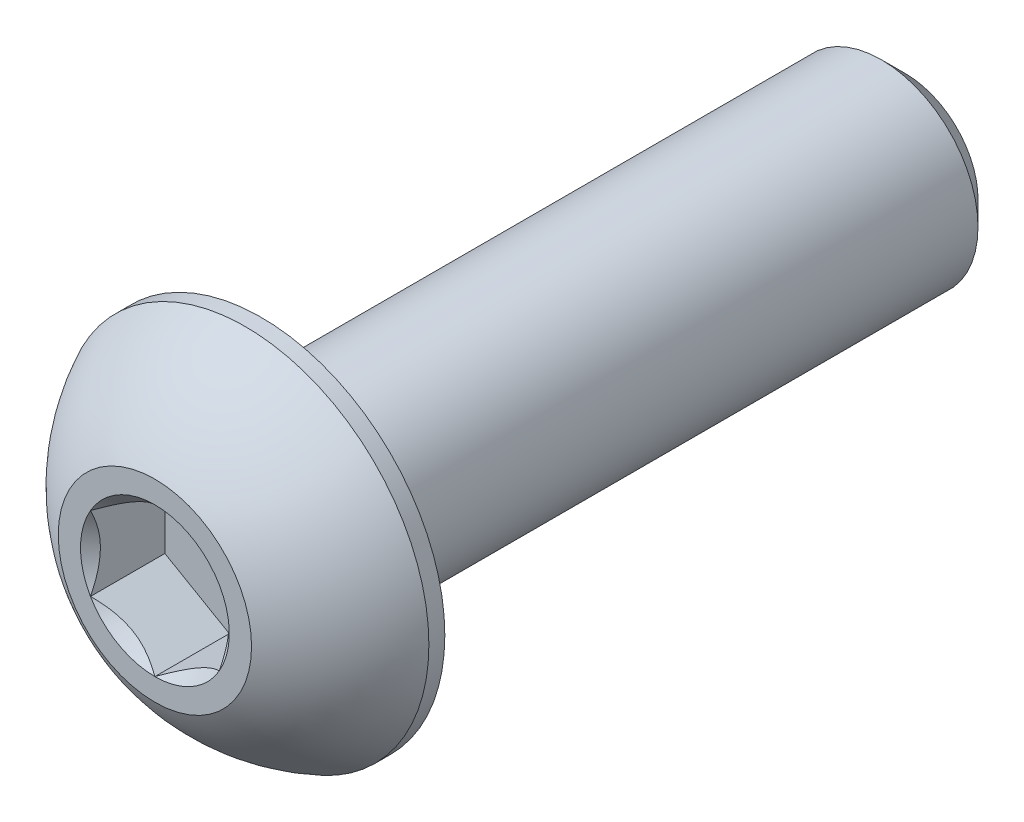
ISO-10303-21;
HEADER;
FILE_DESCRIPTION(('STEP AP214'),'2;1');
FILE_NAME('part.step','',(''),(''),'','','');
FILE_SCHEMA(('AUTOMOTIVE_DESIGN { 1 0 10303 214 1 1 1 1 }'));
ENDSEC;
DATA;
#1=APPLICATION_CONTEXT('core data for automotive mechanical design processes');
#2=APPLICATION_PROTOCOL_DEFINITION('international standard','automotive_design',2000,#1);
#3=PRODUCT_CONTEXT('',#1,'mechanical');
#4=PRODUCT('Part','Part','',(#3));
#5=PRODUCT_RELATED_PRODUCT_CATEGORY('part','',(#4));
#6=PRODUCT_DEFINITION_FORMATION('','',#4);
#7=PRODUCT_DEFINITION_CONTEXT('part definition',#1,'design');
#8=PRODUCT_DEFINITION('design','',#6,#7);
#9=PRODUCT_DEFINITION_SHAPE('','',#8);
#10=(LENGTH_UNIT() NAMED_UNIT(*) SI_UNIT(.MILLI.,.METRE.));
#11=(NAMED_UNIT(*) PLANE_ANGLE_UNIT() SI_UNIT($,.RADIAN.));
#12=(NAMED_UNIT(*) SI_UNIT($,.STERADIAN.) SOLID_ANGLE_UNIT());
#13=UNCERTAINTY_MEASURE_WITH_UNIT(LENGTH_MEASURE(1.E-05),#10,'distance_accuracy_value','');
#14=(GEOMETRIC_REPRESENTATION_CONTEXT(3) GLOBAL_UNCERTAINTY_ASSIGNED_CONTEXT((#13)) GLOBAL_UNIT_ASSIGNED_CONTEXT((#10,
#11,#12)) REPRESENTATION_CONTEXT('',''));
#15=CARTESIAN_POINT('',(0.,0.,0.));
#16=DIRECTION('',(0.,0.,1.));
#17=DIRECTION('',(1.,0.,0.));
#18=AXIS2_PLACEMENT_3D('',#15,#16,#17);
#19=CARTESIAN_POINT('',(0.,-1.5,-11.65));
#20=DIRECTION('',(0.,0.,-1.));
#21=DIRECTION('',(0.,1.,0.));
#22=AXIS2_PLACEMENT_3D('',#19,#20,#21);
#23=PLANE('',#22);
#24=CARTESIAN_POINT('',(0.,0.,-11.65));
#25=DIRECTION('',(0.,0.,-1.));
#26=DIRECTION('',(0.,1.,0.));
#27=AXIS2_PLACEMENT_3D('',#24,#25,#26);
#28=CIRCLE('',#27,1.125);
#29=CARTESIAN_POINT('',(0.,1.125,-11.65));
#30=VERTEX_POINT('',#29);
#31=EDGE_CURVE('E181',#30,#30,#28,.T.);
#32=ORIENTED_EDGE('',*,*,#31,.T.);
#33=EDGE_LOOP('',(#32));
#34=FACE_BOUND('',#33,.T.);
#35=ADVANCED_FACE('F41',(#34),#23,.T.);
#36=CARTESIAN_POINT('',(0.,0.,-11.65));
#37=DIRECTION('',(0.,0.,-1.));
#38=DIRECTION('',(0.,1.,0.));
#39=AXIS2_PLACEMENT_3D('',#36,#37,#38);
#40=CYLINDRICAL_SURFACE('',#39,1.5);
#41=CARTESIAN_POINT('',(0.,0.,-11.275));
#42=DIRECTION('',(0.,0.,-1.));
#43=DIRECTION('',(0.,1.,0.));
#44=AXIS2_PLACEMENT_3D('',#41,#42,#43);
#45=CIRCLE('',#44,1.5);
#46=CARTESIAN_POINT('',(0.,1.5,-11.275));
#47=VERTEX_POINT('',#46);
#48=EDGE_CURVE('E55',#47,#47,#45,.F.);
#49=ORIENTED_EDGE('',*,*,#48,.T.);
#50=EDGE_LOOP('',(#49));
#51=FACE_BOUND('',#50,.T.);
#52=CARTESIAN_POINT('',(0.,0.,-1.65));
#53=DIRECTION('',(0.,0.,1.));
#54=DIRECTION('',(1.,0.,0.));
#55=AXIS2_PLACEMENT_3D('',#52,#53,#54);
#56=CIRCLE('',#55,1.5);
#57=CARTESIAN_POINT('',(1.5,0.,-1.65));
#58=VERTEX_POINT('',#57);
#59=EDGE_CURVE('E178',#58,#58,#56,.F.);
#60=ORIENTED_EDGE('',*,*,#59,.T.);
#61=EDGE_LOOP('',(#60));
#62=FACE_BOUND('',#61,.T.);
#63=ADVANCED_FACE('F186',(#51,#62),#40,.T.);
#64=CARTESIAN_POINT('',(0.,0.,-11.65));
#65=DIRECTION('',(0.,0.,1.));
#66=DIRECTION('',(0.,-1.,0.));
#67=AXIS2_PLACEMENT_3D('',#64,#65,#66);
#68=CONICAL_SURFACE('',#67,1.125,0.785398163397451);
#69=ORIENTED_EDGE('',*,*,#48,.F.);
#70=EDGE_LOOP('',(#69));
#71=FACE_BOUND('',#70,.T.);
#72=ORIENTED_EDGE('',*,*,#31,.F.);
#73=EDGE_LOOP('',(#72));
#74=FACE_BOUND('',#73,.T.);
#75=ADVANCED_FACE('F43',(#71,#74),#68,.T.);
#76=CARTESIAN_POINT('',(0.,0.,-2.79483288770053));
#77=DIRECTION('',(0.,0.,1.));
#78=DIRECTION('',(0.,-1.,0.));
#79=AXIS2_PLACEMENT_3D('',#76,#77,#78);
#80=SPHERICAL_SURFACE('',#79,3.17192226735973);
#81=CARTESIAN_POINT('',(0.,0.,0.));
#82=DIRECTION('',(0.,0.,1.));
#83=DIRECTION('',(1.,0.,0.));
#84=AXIS2_PLACEMENT_3D('',#81,#82,#83);
#85=CIRCLE('',#84,1.5);
#86=CARTESIAN_POINT('',(0.,-1.5,0.));
#87=VERTEX_POINT('',#86);
#88=EDGE_CURVE('E175',#87,#87,#85,.T.);
#89=CARTESIAN_POINT('',(0.,0.,-1.4025));
#90=DIRECTION('',(0.,0.,1.));
#91=DIRECTION('',(1.,0.,0.));
#92=AXIS2_PLACEMENT_3D('',#89,#90,#91);
#93=CIRCLE('',#92,2.85);
#94=CARTESIAN_POINT('',(0.,-2.85,-1.4025));
#95=VERTEX_POINT('',#94);
#96=EDGE_CURVE('E169',#95,#95,#93,.T.);
#97=CARTESIAN_POINT('',(0.,-1.5,0.));
#98=CARTESIAN_POINT('',(0.,-1.5181600798921,-0.00974656947336528));
#99=CARTESIAN_POINT('',(0.,-1.53622513742981,-0.0196701847238475));
#100=CARTESIAN_POINT('',(0.,-1.57215840256594,-0.0398676311293121));
#101=CARTESIAN_POINT('',(0.,-1.59002661016438,-0.0501414622842944));
#102=CARTESIAN_POINT('',(0.,-1.6255593701915,-0.0710354648490241));
#103=CARTESIAN_POINT('',(0.,-1.64322392262019,-0.0816556362587714));
#104=CARTESIAN_POINT('',(0.,-1.67834266450262,-0.103238276426967));
#105=CARTESIAN_POINT('',(0.,-1.69579685395636,-0.114200745185416));
#106=CARTESIAN_POINT('',(0.,-1.73048823664554,-0.136463816635606));
#107=CARTESIAN_POINT('',(0.,-1.74772542988099,-0.147764419327347));
#108=CARTESIAN_POINT('',(0.,-1.78197627078176,-0.170699464187153));
#109=CARTESIAN_POINT('',(0.,-1.79898991844709,-0.182333906355219));
#110=CARTESIAN_POINT('',(0.,-1.83278720341135,-0.205932209546912));
#111=CARTESIAN_POINT('',(0.,-1.84957084071028,-0.21789607057054));
#112=CARTESIAN_POINT('',(0.,-1.88290172764636,-0.242148665498754));
#113=CARTESIAN_POINT('',(0.,-1.89944897728351,-0.254437399403341));
#114=CARTESIAN_POINT('',(0.,-1.93230080139369,-0.279335070725423));
#115=CARTESIAN_POINT('',(0.,-1.94860537586673,-0.291944008142919));
#116=CARTESIAN_POINT('',(0.,-1.98096565436365,-0.317477295441111));
#117=CARTESIAN_POINT('',(0.,-1.99702135838753,-0.330401645321807));
#118=CARTESIAN_POINT('',(0.,-2.02887779526297,-0.356560846652225));
#119=CARTESIAN_POINT('',(0.,-2.04467852811452,-0.369795698101948));
#120=CARTESIAN_POINT('',(0.,-2.07601901880464,-0.396570873693307));
#121=CARTESIAN_POINT('',(0.,-2.09155877664321,-0.410111197834942));
#122=CARTESIAN_POINT('',(0.,-2.12237141262985,-0.437492173862106));
#123=CARTESIAN_POINT('',(0.,-2.13764429077792,-0.451332825747633));
#124=CARTESIAN_POINT('',(0.,-2.16791736411296,-0.479309198198268));
#125=CARTESIAN_POINT('',(0.,-2.18291755929993,-0.493444918763374));
#126=CARTESIAN_POINT('',(0.,-2.21263956705415,-0.52200605739095));
#127=CARTESIAN_POINT('',(0.,-2.22736137962139,-0.536431475453418));
#128=CARTESIAN_POINT('',(0.,-2.2565210282552,-0.56556652781647));
#129=CARTESIAN_POINT('',(0.,-2.27095886432178,-0.580276162117054));
#130=CARTESIAN_POINT('',(0.,-2.2995450739765,-0.609974057702794));
#131=CARTESIAN_POINT('',(0.,-2.31369344756465,-0.624962318987951));
#132=CARTESIAN_POINT('',(0.,-2.34169535627252,-0.655211773418758));
#133=CARTESIAN_POINT('',(0.,-2.35554889139224,-0.670472966564409));
#134=CARTESIAN_POINT('',(0.,-2.38295585920366,-0.701262485885582));
#135=CARTESIAN_POINT('',(0.,-2.39650929189537,-0.716790812061104));
#136=CARTESIAN_POINT('',(0.,-2.42331090492182,-0.748108697108241));
#137=CARTESIAN_POINT('',(0.,-2.43655908525656,-0.763898255979857));
#138=CARTESIAN_POINT('',(0.,-2.46274515962755,-0.795732606824226));
#139=CARTESIAN_POINT('',(0.,-2.47568305366379,-0.811777398796979));
#140=CARTESIAN_POINT('',(0.,-2.50124363939651,-0.844116119267125));
#141=CARTESIAN_POINT('',(0.,-2.51386633109298,-0.860410047764518));
#142=CARTESIAN_POINT('',(0.,-2.53879171587278,-0.893240850042598));
#143=CARTESIAN_POINT('',(0.,-2.55109440895612,-0.909777723823286));
#144=CARTESIAN_POINT('',(0.,-2.57537512182785,-0.943088133113639));
#145=CARTESIAN_POINT('',(0.,-2.58735314161625,-0.959861668623304));
#146=CARTESIAN_POINT('',(0.,-2.61097995657956,-0.993639027894245));
#147=CARTESIAN_POINT('',(0.,-2.62262875175448,-1.01064285165552));
#148=CARTESIAN_POINT('',(0.,-2.64559269128198,-1.04487432644225));
#149=CARTESIAN_POINT('',(0.,-2.65690783563458,-1.06210197746771));
#150=CARTESIAN_POINT('',(0.,-2.67920017403639,-1.09677456077299));
#151=CARTESIAN_POINT('',(0.,-2.69017736808561,-1.11421949305282));
#152=CARTESIAN_POINT('',(0.,-2.711789634999,-1.14932001019995));
#153=CARTESIAN_POINT('',(0.,-2.72242470786316,-1.16697559506725));
#154=CARTESIAN_POINT('',(0.,-2.74334869082118,-1.20249070903942));
#155=CARTESIAN_POINT('',(0.,-2.75363760091502,-1.22035023814429));
#156=CARTESIAN_POINT('',(0.,-2.77386535089241,-1.25626645340824));
#157=CARTESIAN_POINT('',(0.,-2.78380419077596,-1.27432313956732));
#158=CARTESIAN_POINT('',(0.,-2.80332801615778,-1.31062681184411));
#159=CARTESIAN_POINT('',(0.,-2.81291300165605,-1.32887379796182));
#160=CARTESIAN_POINT('',(0.,-2.83172550494215,-1.3655511220839));
#161=CARTESIAN_POINT('',(0.,-2.84095302272998,-1.38398146008827));
#162=CARTESIAN_POINT('',(0.,-2.85,-1.4025));
#163=B_SPLINE_CURVE_WITH_KNOTS('',3,(#97,#98,#99,#100,#101,#102,#103,#104,#105,#106,#107,#108,
#109,#110,#111,#112,#113,#114,#115,#116,#117,#118,#119,#120,#121,#122,#123,#124,#125,#126,#127,
#128,#129,#130,#131,#132,#133,#134,#135,#136,#137,#138,#139,#140,#141,#142,#143,#144,#145,#146,
#147,#148,#149,#150,#151,#152,#153,#154,#155,#156,#157,#158,#159,#160,#161,#162),.UNSPECIFIED.,
.F.,.F.,(4,2,2,2,2,2,2,2,2,2,2,2,2,2,2,2,2,2,2,2,2,2,2,2,2,2,2,2,2,2,2,2,4),(0.,
0.0618298941826979,0.123659788365397,0.185489682548095,0.247319576730792,0.309149470913491,
0.370979365096189,0.432809259278888,0.494639153461586,0.556469047644284,0.618298941826982,
0.68012883600968,0.741958730192378,0.803788624375077,0.865618518557775,0.927448412740473,
0.989278306923171,1.05110820110587,1.11293809528857,1.17476798947127,1.23659788365396,
1.29842777783666,1.36025767201936,1.42208756620206,1.48391746038476,1.54574735456745,
1.60757724875015,1.66940714293285,1.73123703711555,1.79306693129825,1.85489682548095,
1.91672671966364,1.97855661384634),.UNSPECIFIED.);
#164=EDGE_CURVE('BSEAM191',#87,#95,#163,.T.);
#165=ORIENTED_EDGE('',*,*,#88,.F.);
#166=ORIENTED_EDGE('',*,*,#96,.T.);
#167=ORIENTED_EDGE('',*,*,#164,.T.);
#168=ORIENTED_EDGE('',*,*,#164,.F.);
#169=EDGE_LOOP('',(#165,#167,#166,#168));
#170=FACE_BOUND('',#169,.T.);
#171=ADVANCED_FACE('F191',(#170),#80,.T.);
#172=CARTESIAN_POINT('',(0.,-1.5,0.));
#173=DIRECTION('',(0.,0.,-1.));
#174=DIRECTION('',(-1.,0.,0.));
#175=AXIS2_PLACEMENT_3D('',#172,#173,#174);
#176=PLANE('',#175);
#177=CARTESIAN_POINT('',(0.,0.,0.));
#178=DIRECTION('',(0.,0.,1.));
#179=DIRECTION('',(1.,0.,0.));
#180=AXIS2_PLACEMENT_3D('',#177,#178,#179);
#181=CIRCLE('',#180,1.15470053837925);
#182=CARTESIAN_POINT('',(-1.,0.577350269189626,0.));
#183=VERTEX_POINT('',#182);
#184=CARTESIAN_POINT('',(-1.,-0.577350269189626,0.));
#185=VERTEX_POINT('',#184);
#186=EDGE_CURVE('E68',#183,#185,#181,.T.);
#187=ORIENTED_EDGE('',*,*,#186,.F.);
#188=CARTESIAN_POINT('',(0.,1.15470053837925,0.));
#189=VERTEX_POINT('',#188);
#190=EDGE_CURVE('E140',#189,#183,#181,.T.);
#191=ORIENTED_EDGE('',*,*,#190,.F.);
#192=CARTESIAN_POINT('',(1.,0.577350269189626,0.));
#193=VERTEX_POINT('',#192);
#194=EDGE_CURVE('E137',#193,#189,#181,.T.);
#195=ORIENTED_EDGE('',*,*,#194,.F.);
#196=CARTESIAN_POINT('',(1.,-0.577350269189626,0.));
#197=VERTEX_POINT('',#196);
#198=EDGE_CURVE('E108',#197,#193,#181,.T.);
#199=ORIENTED_EDGE('',*,*,#198,.F.);
#200=CARTESIAN_POINT('',(0.,-1.15470053837925,0.));
#201=VERTEX_POINT('',#200);
#202=EDGE_CURVE('E100',#201,#197,#181,.T.);
#203=ORIENTED_EDGE('',*,*,#202,.F.);
#204=EDGE_CURVE('E61',#185,#201,#181,.T.);
#205=ORIENTED_EDGE('',*,*,#204,.F.);
#206=EDGE_LOOP('',(#187,#191,#195,#199,#203,#205));
#207=FACE_BOUND('',#206,.T.);
#208=ORIENTED_EDGE('',*,*,#88,.T.);
#209=EDGE_LOOP('',(#208));
#210=FACE_BOUND('',#209,.T.);
#211=ADVANCED_FACE('F134',(#207,#210),#176,.F.);
#212=CARTESIAN_POINT('',(0.,-2.85,-1.65));
#213=DIRECTION('',(0.,0.,1.));
#214=DIRECTION('',(1.,0.,0.));
#215=AXIS2_PLACEMENT_3D('',#212,#213,#214);
#216=PLANE('',#215);
#217=ORIENTED_EDGE('',*,*,#59,.F.);
#218=EDGE_LOOP('',(#217));
#219=FACE_BOUND('',#218,.T.);
#220=CARTESIAN_POINT('',(0.,0.,-1.65));
#221=DIRECTION('',(0.,0.,1.));
#222=DIRECTION('',(1.,0.,0.));
#223=AXIS2_PLACEMENT_3D('',#220,#221,#222);
#224=CIRCLE('',#223,2.85);
#225=CARTESIAN_POINT('',(2.85,0.,-1.65));
#226=VERTEX_POINT('',#225);
#227=EDGE_CURVE('E172',#226,#226,#224,.T.);
#228=ORIENTED_EDGE('',*,*,#227,.F.);
#229=EDGE_LOOP('',(#228));
#230=FACE_BOUND('',#229,.T.);
#231=ADVANCED_FACE('F205',(#219,#230),#216,.F.);
#232=CARTESIAN_POINT('',(0.,0.,0.));
#233=DIRECTION('',(0.,0.,1.));
#234=DIRECTION('',(1.,0.,0.));
#235=AXIS2_PLACEMENT_3D('',#232,#233,#234);
#236=CYLINDRICAL_SURFACE('',#235,2.85);
#237=ORIENTED_EDGE('',*,*,#96,.F.);
#238=EDGE_LOOP('',(#237));
#239=FACE_BOUND('',#238,.T.);
#240=ORIENTED_EDGE('',*,*,#227,.T.);
#241=EDGE_LOOP('',(#240));
#242=FACE_BOUND('',#241,.T.);
#243=ADVANCED_FACE('F208',(#239,#242),#236,.T.);
#244=CARTESIAN_POINT('',(0.,0.,0.));
#245=DIRECTION('',(0.,0.,1.));
#246=DIRECTION('',(1.,0.,0.));
#247=AXIS2_PLACEMENT_3D('',#244,#245,#246);
#248=CONICAL_SURFACE('',#247,1.15470053837925,0.78539816339745);
#249=ORIENTED_EDGE('',*,*,#198,.T.);
#250=CARTESIAN_POINT('',(1.,-1.15147208646462,0.37038567751386));
#251=CARTESIAN_POINT('',(1.,-1.12343447988552,0.349219919873711));
#252=CARTESIAN_POINT('',(1.,-1.09524064850697,0.328261692175909));
#253=CARTESIAN_POINT('',(1.,-1.03847715644376,0.28684602223562));
#254=CARTESIAN_POINT('',(1.,-1.00990740382975,0.266388706123658));
#255=CARTESIAN_POINT('',(1.,-0.923120894333476,0.205604794954508));
#256=CARTESIAN_POINT('',(1.,-0.864253173759059,0.166192228961397));
#257=CARTESIAN_POINT('',(1.,-0.740809858258045,0.0888206642002041));
#258=CARTESIAN_POINT('',(1.,-0.676100255137807,0.0510730391143413));
#259=CARTESIAN_POINT('',(1.,-0.543448939049124,-0.0179754124487091));
#260=CARTESIAN_POINT('',(1.,-0.475519112027778,-0.0492979721531354));
#261=CARTESIAN_POINT('',(1.,-0.373555850333528,-0.0876182211162059));
#262=CARTESIAN_POINT('',(1.,-0.341031989670907,-0.0986164083578445));
#263=CARTESIAN_POINT('',(1.,-0.275199079052293,-0.11800165785264));
#264=CARTESIAN_POINT('',(1.,-0.241889975173933,-0.126388540223302));
#265=CARTESIAN_POINT('',(1.,-0.175247517042992,-0.139974779280984));
#266=CARTESIAN_POINT('',(1.,-0.141925568218174,-0.145229209232033));
#267=CARTESIAN_POINT('',(1.,-0.0749144362322786,-0.152451313429108));
#268=CARTESIAN_POINT('',(1.,-0.0412251978501615,-0.154418486389493));
#269=CARTESIAN_POINT('',(1.,0.0249580992634212,-0.15491680160684));
#270=CARTESIAN_POINT('',(1.,0.0574512826460394,-0.153569732111366));
#271=CARTESIAN_POINT('',(1.,0.122148505701867,-0.147783515501016));
#272=CARTESIAN_POINT('',(1.,0.154352610132927,-0.143345079338465));
#273=CARTESIAN_POINT('',(1.,0.21879989886764,-0.131543169854797));
#274=CARTESIAN_POINT('',(1.,0.251033743268954,-0.124129458961492));
#275=CARTESIAN_POINT('',(1.,0.314797132354919,-0.106771057501325));
#276=CARTESIAN_POINT('',(1.,0.346326735731005,-0.096826578711171));
#277=CARTESIAN_POINT('',(1.,0.445594187730205,-0.061776517445664));
#278=CARTESIAN_POINT('',(1.,0.511919139476037,-0.0326791416432762));
#279=CARTESIAN_POINT('',(1.,0.641453244657532,0.032015329686504));
#280=CARTESIAN_POINT('',(1.,0.704650133126344,0.0676357767152409));
#281=CARTESIAN_POINT('',(1.,0.825428490174987,0.141123901346934));
#282=CARTESIAN_POINT('',(1.,0.883132947867685,0.178791947135463));
#283=CARTESIAN_POINT('',(1.,0.968148853704565,0.237022852943162));
#284=CARTESIAN_POINT('',(1.,0.996120570380285,0.256638475762855));
#285=CARTESIAN_POINT('',(1.,1.05168177729901,0.29638851706127));
#286=CARTESIAN_POINT('',(1.,1.079271369977,0.316522792198831));
#287=CARTESIAN_POINT('',(1.,1.10670185346329,0.336872119072971));
#288=B_SPLINE_CURVE_WITH_KNOTS('',3,(#250,#251,#252,#253,#254,#255,#256,#257,#258,#259,#260,
#261,#262,#263,#264,#265,#266,#267,#268,#269,#270,#271,#272,#273,#274,#275,#276,#277,#278,#279,
#280,#281,#282,#283,#284,#285,#286,#287),.UNSPECIFIED.,.F.,.F.,(4,2,2,2,2,2,2,2,2,2,2,2,2,2,2,2,
2,2,4),(0.,0.105386459083291,0.210799187330124,0.423233611565468,0.647793540908503,
0.871580877738609,0.97449307418142,1.07741235827201,1.17846428203205,1.27953161415762,
1.3769408673961,1.47432772585408,1.57343322804293,1.67253043972851,1.88917353996827,
2.10660791038813,2.31323734249843,2.41572589232044,2.51818641476503),.UNSPECIFIED.);
#289=EDGE_CURVE('E11',#197,#193,#288,.T.);
#290=ORIENTED_EDGE('',*,*,#289,.F.);
#291=EDGE_LOOP('',(#249,#290));
#292=FACE_BOUND('',#291,.T.);
#293=ADVANCED_FACE('F112',(#292),#248,.F.);
#294=ORIENTED_EDGE('',*,*,#194,.T.);
#295=CARTESIAN_POINT('',(1.0002,0.577234799135788,0.00011548737261379));
#296=CARTESIAN_POINT('',(0.965817404992819,0.597085599618622,-0.0197220691742672));
#297=CARTESIAN_POINT('',(0.930859881860175,0.617268335009457,-0.0383949793611113));
#298=CARTESIAN_POINT('',(0.85957719704391,0.658423412276686,-0.0725852572768423));
#299=CARTESIAN_POINT('',(0.823245249471016,0.67939967198808,-0.0880835909765416));
#300=CARTESIAN_POINT('',(0.749983386196689,0.721697428470847,-0.114632692857735));
#301=CARTESIAN_POINT('',(0.713072148554586,0.743008141459637,-0.125750226003074));
#302=CARTESIAN_POINT('',(0.638437270689141,0.786098608286186,-0.142880134223818));
#303=CARTESIAN_POINT('',(0.600715911891364,0.807877044942281,-0.148905302533328));
#304=CARTESIAN_POINT('',(0.535707801582067,0.845409494928863,-0.154339445032507));
#305=CARTESIAN_POINT('',(0.508505628471828,0.861114676896602,-0.155143061683268));
#306=CARTESIAN_POINT('',(0.454153959330888,0.892494627706029,-0.153793300583113));
#307=CARTESIAN_POINT('',(0.427004476245124,0.908169389073954,-0.151639270452801));
#308=CARTESIAN_POINT('',(0.34594372267304,0.954969836969511,-0.140883027871529));
#309=CARTESIAN_POINT('',(0.292435859021573,0.985862616452447,-0.127985443584644));
#310=CARTESIAN_POINT('',(0.198523934856568,1.04008269114923,-0.0968592693978228));
#311=CARTESIAN_POINT('',(0.157679476328165,1.06366425027551,-0.0802622022981607));
#312=CARTESIAN_POINT('',(0.0775903626180559,1.1099037216352,-0.0428750753147074));
#313=CARTESIAN_POINT('',(0.0383409891295618,1.1325643579843,-0.0220986581825969));
#314=CARTESIAN_POINT('',(-0.000200000000000448,1.15481600843309,0.000115487372613952));
#315=B_SPLINE_CURVE_WITH_KNOTS('',3,(#295,#296,#297,#298,#299,#300,#301,#302,#303,#304,#305,
#306,#307,#308,#309,#310,#311,#312,#313,#314),.UNSPECIFIED.,.F.,.F.,(4,2,2,2,2,2,2,2,2,4),(0.,
0.133237676828559,0.26725222983449,0.3991370762693,0.530689603280768,0.624814864263846,
0.718960890149133,0.907306626112097,1.05710100361789,1.20641411519286),.UNSPECIFIED.);
#316=EDGE_CURVE('E139',#193,#189,#315,.T.);
#317=ORIENTED_EDGE('',*,*,#316,.F.);
#318=EDGE_LOOP('',(#294,#317));
#319=FACE_BOUND('',#318,.T.);
#320=ADVANCED_FACE('F293',(#319),#248,.F.);
#321=ORIENTED_EDGE('',*,*,#190,.T.);
#322=CARTESIAN_POINT('',(0.000199999999999653,1.15481600843309,0.000115487372613877));
#323=CARTESIAN_POINT('',(-0.034182595007181,1.13496520795026,-0.0197220691742673));
#324=CARTESIAN_POINT('',(-0.0691401181398251,1.11478247255942,-0.0383949793611114));
#325=CARTESIAN_POINT('',(-0.14042280295609,1.07362739529219,-0.0725852572768422));
#326=CARTESIAN_POINT('',(-0.176754750528985,1.0526511355808,-0.0880835909765414));
#327=CARTESIAN_POINT('',(-0.250016613803312,1.01035337909803,-0.114632692857735));
#328=CARTESIAN_POINT('',(-0.286927851445415,0.989042666109241,-0.125750226003074));
#329=CARTESIAN_POINT('',(-0.36156272931086,0.945952199282691,-0.142880134223818));
#330=CARTESIAN_POINT('',(-0.399284088108636,0.924173762626596,-0.148905302533328));
#331=CARTESIAN_POINT('',(-0.464292198417934,0.886641312640014,-0.154339445032506));
#332=CARTESIAN_POINT('',(-0.491494371528172,0.870936130672275,-0.155143061683268));
#333=CARTESIAN_POINT('',(-0.545846040669112,0.839556179862848,-0.153793300583113));
#334=CARTESIAN_POINT('',(-0.572995523754876,0.823881418494923,-0.151639270452801));
#335=CARTESIAN_POINT('',(-0.65405627732696,0.777080970599367,-0.140883027871529));
#336=CARTESIAN_POINT('',(-0.707564140978428,0.74618819111643,-0.127985443584644));
#337=CARTESIAN_POINT('',(-0.801476065143432,0.691968116419649,-0.096859269397823));
#338=CARTESIAN_POINT('',(-0.842320523671834,0.668386557293371,-0.0802622022981609));
#339=CARTESIAN_POINT('',(-0.922409637381944,0.622147085933681,-0.0428750753147075));
#340=CARTESIAN_POINT('',(-0.961659010870438,0.599486449584575,-0.0220986581825969));
#341=CARTESIAN_POINT('',(-1.0002,0.577234799135788,0.000115487372613623));
#342=B_SPLINE_CURVE_WITH_KNOTS('',3,(#322,#323,#324,#325,#326,#327,#328,#329,#330,#331,#332,
#333,#334,#335,#336,#337,#338,#339,#340,#341),.UNSPECIFIED.,.F.,.F.,(4,2,2,2,2,2,2,2,2,4),(0.,
0.133237676828559,0.26725222983449,0.3991370762693,0.530689603280768,0.624814864263846,
0.718960890149133,0.907306626112098,1.05710100361789,1.20641411519286),.UNSPECIFIED.);
#343=EDGE_CURVE('E144',#189,#183,#342,.T.);
#344=ORIENTED_EDGE('',*,*,#343,.F.);
#345=EDGE_LOOP('',(#321,#344));
#346=FACE_BOUND('',#345,.T.);
#347=ADVANCED_FACE('F147',(#346),#248,.F.);
#348=ORIENTED_EDGE('',*,*,#186,.T.);
#349=CARTESIAN_POINT('',(-1.,-1.15147208646462,0.370385677513861));
#350=CARTESIAN_POINT('',(-1.,-1.12343447988552,0.349219919873711));
#351=CARTESIAN_POINT('',(-1.,-1.09524064850697,0.328261692175909));
#352=CARTESIAN_POINT('',(-1.,-1.03847715644376,0.286846022235621));
#353=CARTESIAN_POINT('',(-1.,-1.00990740382975,0.266388706123658));
#354=CARTESIAN_POINT('',(-1.,-0.923120894333477,0.205604794954509));
#355=CARTESIAN_POINT('',(-1.,-0.86425317375906,0.166192228961397));
#356=CARTESIAN_POINT('',(-1.,-0.740809858258046,0.0888206642002046));
#357=CARTESIAN_POINT('',(-1.,-0.676100255137807,0.0510730391143418));
#358=CARTESIAN_POINT('',(-1.,-0.543448939049125,-0.0179754124487088));
#359=CARTESIAN_POINT('',(-1.,-0.475519112027779,-0.0492979721531352));
#360=CARTESIAN_POINT('',(-1.,-0.373555850333529,-0.0876182211162059));
#361=CARTESIAN_POINT('',(-1.,-0.341031989670908,-0.0986164083578445));
#362=CARTESIAN_POINT('',(-1.,-0.275199079052293,-0.11800165785264));
#363=CARTESIAN_POINT('',(-1.,-0.241889975173933,-0.126388540223302));
#364=CARTESIAN_POINT('',(-1.,-0.175247517042993,-0.139974779280984));
#365=CARTESIAN_POINT('',(-1.,-0.141925568218175,-0.145229209232033));
#366=CARTESIAN_POINT('',(-1.,-0.074914436232279,-0.152451313429108));
#367=CARTESIAN_POINT('',(-1.,-0.0412251978501618,-0.154418486389493));
#368=CARTESIAN_POINT('',(-1.,0.0249580992634209,-0.15491680160684));
#369=CARTESIAN_POINT('',(-1.,0.0574512826460391,-0.153569732111367));
#370=CARTESIAN_POINT('',(-1.,0.122148505701867,-0.147783515501016));
#371=CARTESIAN_POINT('',(-1.,0.154352610132926,-0.143345079338465));
#372=CARTESIAN_POINT('',(-1.,0.21879989886764,-0.131543169854797));
#373=CARTESIAN_POINT('',(-1.,0.251033743268953,-0.124129458961492));
#374=CARTESIAN_POINT('',(-1.,0.314797132354919,-0.106771057501325));
#375=CARTESIAN_POINT('',(-1.,0.346326735731004,-0.0968265787111712));
#376=CARTESIAN_POINT('',(-1.,0.445594187730205,-0.0617765174456643));
#377=CARTESIAN_POINT('',(-1.,0.511919139476036,-0.0326791416432765));
#378=CARTESIAN_POINT('',(-1.,0.641453244657531,0.0320153296865035));
#379=CARTESIAN_POINT('',(-1.,0.704650133126343,0.0676357767152402));
#380=CARTESIAN_POINT('',(-1.,0.825428490174986,0.141123901346934));
#381=CARTESIAN_POINT('',(-1.,0.883132947867684,0.178791947135462));
#382=CARTESIAN_POINT('',(-1.,0.968148853704564,0.237022852943162));
#383=CARTESIAN_POINT('',(-1.,0.996120570380284,0.256638475762855));
#384=CARTESIAN_POINT('',(-1.,1.05168177729901,0.296388517061269));
#385=CARTESIAN_POINT('',(-1.,1.079271369977,0.31652279219883));
#386=CARTESIAN_POINT('',(-1.,1.10670185346329,0.33687211907297));
#387=B_SPLINE_CURVE_WITH_KNOTS('',3,(#349,#350,#351,#352,#353,#354,#355,#356,#357,#358,#359,
#360,#361,#362,#363,#364,#365,#366,#367,#368,#369,#370,#371,#372,#373,#374,#375,#376,#377,#378,
#379,#380,#381,#382,#383,#384,#385,#386),.UNSPECIFIED.,.F.,.F.,(4,2,2,2,2,2,2,2,2,2,2,2,2,2,2,2,
2,2,4),(0.,0.105386459083291,0.210799187330125,0.423233611565469,0.647793540908503,
0.87158087773861,0.974493074181421,1.07741235827201,1.17846428203205,1.27953161415762,
1.3769408673961,1.47432772585408,1.57343322804293,1.67253043972851,1.88917353996827,
2.10660791038813,2.31323734249843,2.41572589232044,2.51818641476503),.UNSPECIFIED.);
#388=EDGE_CURVE('E151',#183,#185,#387,.F.);
#389=ORIENTED_EDGE('',*,*,#388,.F.);
#390=EDGE_LOOP('',(#348,#389));
#391=FACE_BOUND('',#390,.T.);
#392=ADVANCED_FACE('F287',(#391),#248,.F.);
#393=ORIENTED_EDGE('',*,*,#204,.T.);
#394=CARTESIAN_POINT('',(-1.0002,-0.577234799135788,0.00011548737261379));
#395=CARTESIAN_POINT('',(-0.965817404992819,-0.597085599618622,-0.0197220691742671));
#396=CARTESIAN_POINT('',(-0.930859881860175,-0.617268335009456,-0.0383949793611112));
#397=CARTESIAN_POINT('',(-0.85957719704391,-0.658423412276686,-0.0725852572768422));
#398=CARTESIAN_POINT('',(-0.823245249471016,-0.67939967198808,-0.0880835909765416));
#399=CARTESIAN_POINT('',(-0.749983386196689,-0.721697428470847,-0.114632692857735));
#400=CARTESIAN_POINT('',(-0.713072148554586,-0.743008141459637,-0.125750226003074));
#401=CARTESIAN_POINT('',(-0.638437270689141,-0.786098608286186,-0.142880134223818));
#402=CARTESIAN_POINT('',(-0.600715911891364,-0.807877044942281,-0.148905302533327));
#403=CARTESIAN_POINT('',(-0.535707801582066,-0.845409494928863,-0.154339445032506));
#404=CARTESIAN_POINT('',(-0.508505628471828,-0.861114676896602,-0.155143061683268));
#405=CARTESIAN_POINT('',(-0.454153959330888,-0.892494627706029,-0.153793300583113));
#406=CARTESIAN_POINT('',(-0.427004476245124,-0.908169389073954,-0.151639270452801));
#407=CARTESIAN_POINT('',(-0.34594372267304,-0.954969836969511,-0.140883027871529));
#408=CARTESIAN_POINT('',(-0.292435859021572,-0.985862616452447,-0.127985443584644));
#409=CARTESIAN_POINT('',(-0.198523934856568,-1.04008269114923,-0.0968592693978226));
#410=CARTESIAN_POINT('',(-0.157679476328166,-1.06366425027551,-0.0802622022981606));
#411=CARTESIAN_POINT('',(-0.0775903626180561,-1.1099037216352,-0.0428750753147073));
#412=CARTESIAN_POINT('',(-0.038340989129562,-1.1325643579843,-0.0220986581825967));
#413=CARTESIAN_POINT('',(0.000200000000000127,-1.15481600843309,0.000115487372614116));
#414=B_SPLINE_CURVE_WITH_KNOTS('',3,(#394,#395,#396,#397,#398,#399,#400,#401,#402,#403,#404,
#405,#406,#407,#408,#409,#410,#411,#412,#413),.UNSPECIFIED.,.F.,.F.,(4,2,2,2,2,2,2,2,2,4),(0.,
0.133237676828559,0.26725222983449,0.3991370762693,0.530689603280768,0.624814864263846,
0.718960890149133,0.907306626112098,1.05710100361789,1.20641411519286),.UNSPECIFIED.);
#415=EDGE_CURVE('E124',#185,#201,#414,.T.);
#416=ORIENTED_EDGE('',*,*,#415,.F.);
#417=EDGE_LOOP('',(#393,#416));
#418=FACE_BOUND('',#417,.T.);
#419=ADVANCED_FACE('F235',(#418),#248,.F.);
#420=ORIENTED_EDGE('',*,*,#202,.T.);
#421=CARTESIAN_POINT('',(-0.000199999999999753,-1.15481600843309,0.000115487372614094));
#422=CARTESIAN_POINT('',(0.0341825950071809,-1.13496520795026,-0.019722069174267));
#423=CARTESIAN_POINT('',(0.0691401181398251,-1.11478247255942,-0.0383949793611112));
#424=CARTESIAN_POINT('',(0.14042280295609,-1.07362739529219,-0.0725852572768422));
#425=CARTESIAN_POINT('',(0.176754750528984,-1.0526511355808,-0.0880835909765414));
#426=CARTESIAN_POINT('',(0.250016613803311,-1.01035337909803,-0.114632692857735));
#427=CARTESIAN_POINT('',(0.286927851445415,-0.989042666109241,-0.125750226003074));
#428=CARTESIAN_POINT('',(0.36156272931086,-0.945952199282691,-0.142880134223818));
#429=CARTESIAN_POINT('',(0.399284088108636,-0.924173762626596,-0.148905302533327));
#430=CARTESIAN_POINT('',(0.464292198417934,-0.886641312640014,-0.154339445032506));
#431=CARTESIAN_POINT('',(0.491494371528173,-0.870936130672275,-0.155143061683268));
#432=CARTESIAN_POINT('',(0.545846040669112,-0.839556179862848,-0.153793300583113));
#433=CARTESIAN_POINT('',(0.572995523754876,-0.823881418494923,-0.151639270452801));
#434=CARTESIAN_POINT('',(0.65405627732696,-0.777080970599366,-0.140883027871529));
#435=CARTESIAN_POINT('',(0.707564140978428,-0.74618819111643,-0.127985443584644));
#436=CARTESIAN_POINT('',(0.801476065143432,-0.691968116419649,-0.0968592693978231));
#437=CARTESIAN_POINT('',(0.842320523671835,-0.668386557293371,-0.0802622022981609));
#438=CARTESIAN_POINT('',(0.922409637381944,-0.622147085933681,-0.0428750753147075));
#439=CARTESIAN_POINT('',(0.961659010870438,-0.599486449584575,-0.022098658182597));
#440=CARTESIAN_POINT('',(1.0002,-0.577234799135788,0.000115487372613542));
#441=B_SPLINE_CURVE_WITH_KNOTS('',3,(#421,#422,#423,#424,#425,#426,#427,#428,#429,#430,#431,
#432,#433,#434,#435,#436,#437,#438,#439,#440),.UNSPECIFIED.,.F.,.F.,(4,2,2,2,2,2,2,2,2,4),(0.,
0.133237676828559,0.26725222983449,0.3991370762693,0.530689603280769,0.624814864263847,
0.718960890149133,0.907306626112098,1.05710100361789,1.20641411519286),.UNSPECIFIED.);
#442=EDGE_CURVE('E104',#201,#197,#441,.T.);
#443=ORIENTED_EDGE('',*,*,#442,.F.);
#444=EDGE_LOOP('',(#420,#443));
#445=FACE_BOUND('',#444,.T.);
#446=ADVANCED_FACE('F102',(#445),#248,.F.);
#447=CARTESIAN_POINT('',(1.,-0.577350269189626,-1.155));
#448=DIRECTION('',(0.,0.,1.));
#449=DIRECTION('',(1.,0.,0.));
#450=AXIS2_PLACEMENT_3D('',#447,#448,#449);
#451=PLANE('',#450);
#452=DIRECTION('',(0.866025403784438,0.500000000000001,0.));
#453=VECTOR('',#452,1.);
#454=CARTESIAN_POINT('',(0.,-1.15470053837925,-1.155));
#455=LINE('',#454,#453);
#456=CARTESIAN_POINT('',(0.,-1.15470053837925,-1.155));
#457=VERTEX_POINT('',#456);
#458=CARTESIAN_POINT('',(1.,-0.577350269189626,-1.155));
#459=VERTEX_POINT('',#458);
#460=EDGE_CURVE('E123',#457,#459,#455,.T.);
#461=ORIENTED_EDGE('',*,*,#460,.T.);
#462=DIRECTION('',(0.,1.,0.));
#463=VECTOR('',#462,1.);
#464=CARTESIAN_POINT('',(1.,-0.577350269189626,-1.155));
#465=LINE('',#464,#463);
#466=CARTESIAN_POINT('',(1.,0.577350269189626,-1.155));
#467=VERTEX_POINT('',#466);
#468=EDGE_CURVE('E128',#459,#467,#465,.T.);
#469=ORIENTED_EDGE('',*,*,#468,.T.);
#470=DIRECTION('',(-0.866025403784439,0.5,0.));
#471=VECTOR('',#470,1.);
#472=CARTESIAN_POINT('',(1.,0.577350269189626,-1.155));
#473=LINE('',#472,#471);
#474=CARTESIAN_POINT('',(0.,1.15470053837925,-1.155));
#475=VERTEX_POINT('',#474);
#476=EDGE_CURVE('E277',#467,#475,#473,.T.);
#477=ORIENTED_EDGE('',*,*,#476,.T.);
#478=DIRECTION('',(-0.866025403784438,-0.5,0.));
#479=VECTOR('',#478,1.);
#480=CARTESIAN_POINT('',(0.,1.15470053837925,-1.155));
#481=LINE('',#480,#479);
#482=CARTESIAN_POINT('',(-1.,0.577350269189626,-1.155));
#483=VERTEX_POINT('',#482);
#484=EDGE_CURVE('E160',#475,#483,#481,.T.);
#485=ORIENTED_EDGE('',*,*,#484,.T.);
#486=DIRECTION('',(0.,-1.,0.));
#487=VECTOR('',#486,1.);
#488=CARTESIAN_POINT('',(-1.,0.577350269189626,-1.155));
#489=LINE('',#488,#487);
#490=CARTESIAN_POINT('',(-1.,-0.577350269189626,-1.155));
#491=VERTEX_POINT('',#490);
#492=EDGE_CURVE('E281',#483,#491,#489,.T.);
#493=ORIENTED_EDGE('',*,*,#492,.T.);
#494=DIRECTION('',(0.866025403784439,-0.5,0.));
#495=VECTOR('',#494,1.);
#496=CARTESIAN_POINT('',(-1.,-0.577350269189626,-1.155));
#497=LINE('',#496,#495);
#498=EDGE_CURVE('E131',#491,#457,#497,.T.);
#499=ORIENTED_EDGE('',*,*,#498,.T.);
#500=EDGE_LOOP('',(#461,#469,#477,#485,#493,#499));
#501=FACE_BOUND('',#500,.T.);
#502=ADVANCED_FACE('F234',(#501),#451,.T.);
#503=CARTESIAN_POINT('',(1.,-0.577350269189626,-1.155));
#504=DIRECTION('',(1.,0.,0.));
#505=DIRECTION('',(0.,0.,-1.));
#506=AXIS2_PLACEMENT_3D('',#503,#504,#505);
#507=PLANE('',#506);
#508=DIRECTION('',(0.,0.,1.));
#509=VECTOR('',#508,1.);
#510=CARTESIAN_POINT('',(1.,-0.577350269189626,-1.155));
#511=LINE('',#510,#509);
#512=EDGE_CURVE('E120',#459,#197,#511,.T.);
#513=ORIENTED_EDGE('',*,*,#512,.T.);
#514=ORIENTED_EDGE('',*,*,#289,.T.);
#515=DIRECTION('',(0.,0.,1.));
#516=VECTOR('',#515,1.);
#517=CARTESIAN_POINT('',(1.,0.577350269189626,-1.155));
#518=LINE('',#517,#516);
#519=EDGE_CURVE('E130',#467,#193,#518,.T.);
#520=ORIENTED_EDGE('',*,*,#519,.F.);
#521=ORIENTED_EDGE('',*,*,#468,.F.);
#522=EDGE_LOOP('',(#513,#514,#520,#521));
#523=FACE_BOUND('',#522,.T.);
#524=ADVANCED_FACE('F126',(#523),#507,.F.);
#525=CARTESIAN_POINT('',(1.,0.577350269189626,-1.155));
#526=DIRECTION('',(0.5,0.866025403784439,0.));
#527=DIRECTION('',(-0.866025403784439,0.5,0.));
#528=AXIS2_PLACEMENT_3D('',#525,#526,#527);
#529=PLANE('',#528);
#530=ORIENTED_EDGE('',*,*,#519,.T.);
#531=ORIENTED_EDGE('',*,*,#316,.T.);
#532=DIRECTION('',(0.,0.,1.));
#533=VECTOR('',#532,1.);
#534=CARTESIAN_POINT('',(0.,1.15470053837925,-1.155));
#535=LINE('',#534,#533);
#536=EDGE_CURVE('E156',#475,#189,#535,.T.);
#537=ORIENTED_EDGE('',*,*,#536,.F.);
#538=ORIENTED_EDGE('',*,*,#476,.F.);
#539=EDGE_LOOP('',(#530,#531,#537,#538));
#540=FACE_BOUND('',#539,.T.);
#541=ADVANCED_FACE('F154',(#540),#529,.F.);
#542=CARTESIAN_POINT('',(0.,1.15470053837925,-1.155));
#543=DIRECTION('',(-0.5,0.866025403784438,0.));
#544=DIRECTION('',(-0.866025403784439,-0.5,0.));
#545=AXIS2_PLACEMENT_3D('',#542,#543,#544);
#546=PLANE('',#545);
#547=ORIENTED_EDGE('',*,*,#536,.T.);
#548=ORIENTED_EDGE('',*,*,#343,.T.);
#549=DIRECTION('',(0.,0.,1.));
#550=VECTOR('',#549,1.);
#551=CARTESIAN_POINT('',(-1.,0.577350269189626,-1.155));
#552=LINE('',#551,#550);
#553=EDGE_CURVE('E162',#483,#183,#552,.T.);
#554=ORIENTED_EDGE('',*,*,#553,.F.);
#555=ORIENTED_EDGE('',*,*,#484,.F.);
#556=EDGE_LOOP('',(#547,#548,#554,#555));
#557=FACE_BOUND('',#556,.T.);
#558=ADVANCED_FACE('F158',(#557),#546,.F.);
#559=CARTESIAN_POINT('',(-1.,0.577350269189626,-1.155));
#560=DIRECTION('',(-1.,0.,0.));
#561=DIRECTION('',(0.,0.,1.));
#562=AXIS2_PLACEMENT_3D('',#559,#560,#561);
#563=PLANE('',#562);
#564=ORIENTED_EDGE('',*,*,#553,.T.);
#565=ORIENTED_EDGE('',*,*,#388,.T.);
#566=DIRECTION('',(0.,0.,1.));
#567=VECTOR('',#566,1.);
#568=CARTESIAN_POINT('',(-1.,-0.577350269189626,-1.155));
#569=LINE('',#568,#567);
#570=EDGE_CURVE('E164',#491,#185,#569,.T.);
#571=ORIENTED_EDGE('',*,*,#570,.F.);
#572=ORIENTED_EDGE('',*,*,#492,.F.);
#573=EDGE_LOOP('',(#564,#565,#571,#572));
#574=FACE_BOUND('',#573,.T.);
#575=ADVANCED_FACE('F256',(#574),#563,.F.);
#576=CARTESIAN_POINT('',(-1.,-0.577350269189626,-1.155));
#577=DIRECTION('',(-0.5,-0.866025403784439,0.));
#578=DIRECTION('',(0.866025403784439,-0.5,0.));
#579=AXIS2_PLACEMENT_3D('',#576,#577,#578);
#580=PLANE('',#579);
#581=ORIENTED_EDGE('',*,*,#570,.T.);
#582=ORIENTED_EDGE('',*,*,#415,.T.);
#583=DIRECTION('',(0.,0.,1.));
#584=VECTOR('',#583,1.);
#585=CARTESIAN_POINT('',(0.,-1.15470053837925,-1.155));
#586=LINE('',#585,#584);
#587=EDGE_CURVE('E122',#457,#201,#586,.T.);
#588=ORIENTED_EDGE('',*,*,#587,.F.);
#589=ORIENTED_EDGE('',*,*,#498,.F.);
#590=EDGE_LOOP('',(#581,#582,#588,#589));
#591=FACE_BOUND('',#590,.T.);
#592=ADVANCED_FACE('F215',(#591),#580,.F.);
#593=CARTESIAN_POINT('',(0.,-1.15470053837925,-1.155));
#594=DIRECTION('',(0.500000000000001,-0.866025403784438,0.));
#595=DIRECTION('',(0.866025403784438,0.500000000000001,0.));
#596=AXIS2_PLACEMENT_3D('',#593,#594,#595);
#597=PLANE('',#596);
#598=ORIENTED_EDGE('',*,*,#587,.T.);
#599=ORIENTED_EDGE('',*,*,#442,.T.);
#600=ORIENTED_EDGE('',*,*,#512,.F.);
#601=ORIENTED_EDGE('',*,*,#460,.F.);
#602=EDGE_LOOP('',(#598,#599,#600,#601));
#603=FACE_BOUND('',#602,.T.);
#604=ADVANCED_FACE('F118',(#603),#597,.F.);
#605=CLOSED_SHELL('',(#35,#63,#75,#171,#211,#231,#243,#293,#320,#347,#392,#419,#446,#502,#524,
#541,#558,#575,#592,#604));
#606=MANIFOLD_SOLID_BREP('B2',#605);
#607=ADVANCED_BREP_SHAPE_REPRESENTATION('',(#18,#606),#14);
#608=SHAPE_DEFINITION_REPRESENTATION(#9,#607);
ENDSEC;
END-ISO-10303-21;
